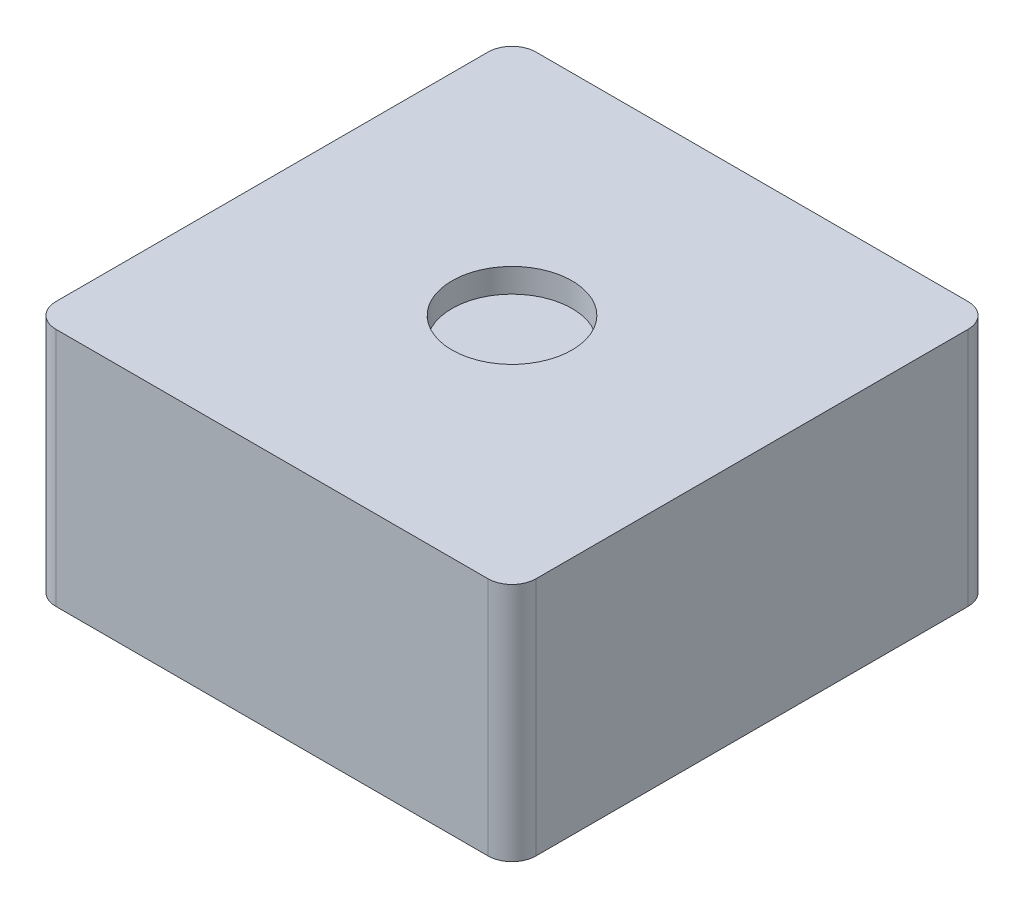
ISO-10303-21;
HEADER;
FILE_DESCRIPTION(('STEP AP214'),'2;1');
FILE_NAME('part.step','',(''),(''),'','','');
FILE_SCHEMA(('AUTOMOTIVE_DESIGN { 1 0 10303 214 1 1 1 1 }'));
ENDSEC;
DATA;
#1=APPLICATION_CONTEXT('core data for automotive mechanical design processes');
#2=APPLICATION_PROTOCOL_DEFINITION('international standard','automotive_design',2000,#1);
#3=PRODUCT_CONTEXT('',#1,'mechanical');
#4=PRODUCT('Part','Part','',(#3));
#5=PRODUCT_RELATED_PRODUCT_CATEGORY('part','',(#4));
#6=PRODUCT_DEFINITION_FORMATION('','',#4);
#7=PRODUCT_DEFINITION_CONTEXT('part definition',#1,'design');
#8=PRODUCT_DEFINITION('design','',#6,#7);
#9=PRODUCT_DEFINITION_SHAPE('','',#8);
#10=(LENGTH_UNIT() NAMED_UNIT(*) SI_UNIT(.MILLI.,.METRE.));
#11=(NAMED_UNIT(*) PLANE_ANGLE_UNIT() SI_UNIT($,.RADIAN.));
#12=(NAMED_UNIT(*) SI_UNIT($,.STERADIAN.) SOLID_ANGLE_UNIT());
#13=UNCERTAINTY_MEASURE_WITH_UNIT(LENGTH_MEASURE(1.E-05),#10,'distance_accuracy_value','');
#14=(GEOMETRIC_REPRESENTATION_CONTEXT(3) GLOBAL_UNCERTAINTY_ASSIGNED_CONTEXT((#13)) GLOBAL_UNIT_ASSIGNED_CONTEXT((#10,
#11,#12)) REPRESENTATION_CONTEXT('',''));
#15=CARTESIAN_POINT('',(0.,0.,0.));
#16=DIRECTION('',(0.,0.,1.));
#17=DIRECTION('',(1.,0.,0.));
#18=AXIS2_PLACEMENT_3D('',#15,#16,#17);
#19=CARTESIAN_POINT('',(0.47619047619,1.8,-0.04761904761905));
#20=DIRECTION('',(0.,1.,0.));
#21=DIRECTION('',(0.,0.,1.));
#22=AXIS2_PLACEMENT_3D('',#19,#20,#21);
#23=PLANE('',#22);
#24=CARTESIAN_POINT('',(0.47619047619,1.8,-0.04761904761905));
#25=DIRECTION('',(0.,1.,0.));
#26=DIRECTION('',(0.,0.,1.));
#27=AXIS2_PLACEMENT_3D('',#24,#25,#26);
#28=CIRCLE('',#27,0.5);
#29=CARTESIAN_POINT('',(0.47619047619,1.8,0.45238095238095));
#30=VERTEX_POINT('',#29);
#31=EDGE_CURVE('E19',#30,#30,#28,.T.);
#32=ORIENTED_EDGE('',*,*,#31,.T.);
#33=EDGE_LOOP('',(#32));
#34=FACE_BOUND('',#33,.T.);
#35=ADVANCED_FACE('F16',(#34),#23,.T.);
#36=CARTESIAN_POINT('',(0.47619047619,1.8,-0.04761904761905));
#37=DIRECTION('',(0.,1.,0.));
#38=DIRECTION('',(0.,0.,1.));
#39=AXIS2_PLACEMENT_3D('',#36,#37,#38);
#40=CYLINDRICAL_SURFACE('',#39,0.5);
#41=CARTESIAN_POINT('',(0.47619047619,2.,-0.04761904761905));
#42=DIRECTION('',(0.,1.,0.));
#43=DIRECTION('',(0.,0.,1.));
#44=AXIS2_PLACEMENT_3D('',#41,#42,#43);
#45=CIRCLE('',#44,0.5);
#46=CARTESIAN_POINT('',(0.47619047619,2.,0.45238095238095));
#47=VERTEX_POINT('',#46);
#48=EDGE_CURVE('E126',#47,#47,#45,.F.);
#49=ORIENTED_EDGE('',*,*,#48,.F.);
#50=EDGE_LOOP('',(#49));
#51=FACE_BOUND('',#50,.T.);
#52=ORIENTED_EDGE('',*,*,#31,.F.);
#53=EDGE_LOOP('',(#52));
#54=FACE_BOUND('',#53,.T.);
#55=ADVANCED_FACE('F193',(#51,#54),#40,.F.);
#56=CARTESIAN_POINT('',(2.27619047619,2.,1.752380952381));
#57=DIRECTION('',(0.,-1.,0.));
#58=DIRECTION('',(0.,0.,-1.));
#59=AXIS2_PLACEMENT_3D('',#56,#57,#58);
#60=CYLINDRICAL_SURFACE('',#59,0.2);
#61=CARTESIAN_POINT('',(2.27619047619,0.,1.752380952381));
#62=DIRECTION('',(0.,-1.,0.));
#63=DIRECTION('',(0.,0.,-1.));
#64=AXIS2_PLACEMENT_3D('',#61,#62,#63);
#65=CIRCLE('',#64,0.2);
#66=CARTESIAN_POINT('',(2.27619047619,0.,1.952380952381));
#67=VERTEX_POINT('',#66);
#68=CARTESIAN_POINT('',(2.47619047619,0.,1.752380952381));
#69=VERTEX_POINT('',#68);
#70=EDGE_CURVE('E57',#67,#69,#65,.F.);
#71=ORIENTED_EDGE('',*,*,#70,.T.);
#72=DIRECTION('',(0.,1.,0.));
#73=VECTOR('',#72,1.);
#74=CARTESIAN_POINT('',(2.47619047619,2.,1.752380952381));
#75=LINE('',#74,#73);
#76=CARTESIAN_POINT('',(2.47619047619,2.,1.752380952381));
#77=VERTEX_POINT('',#76);
#78=EDGE_CURVE('E65',#69,#77,#75,.T.);
#79=ORIENTED_EDGE('',*,*,#78,.T.);
#80=CARTESIAN_POINT('',(2.27619047619,2.,1.752380952381));
#81=DIRECTION('',(0.,-1.,0.));
#82=DIRECTION('',(0.,0.,-1.));
#83=AXIS2_PLACEMENT_3D('',#80,#81,#82);
#84=CIRCLE('',#83,0.2);
#85=CARTESIAN_POINT('',(2.27619047619,2.,1.952380952381));
#86=VERTEX_POINT('',#85);
#87=EDGE_CURVE('E117',#86,#77,#84,.F.);
#88=ORIENTED_EDGE('',*,*,#87,.F.);
#89=DIRECTION('',(0.,1.,0.));
#90=VECTOR('',#89,1.);
#91=CARTESIAN_POINT('',(2.27619047619,2.,1.952380952381));
#92=LINE('',#91,#90);
#93=EDGE_CURVE('E67',#86,#67,#92,.F.);
#94=ORIENTED_EDGE('',*,*,#93,.T.);
#95=EDGE_LOOP('',(#71,#79,#88,#94));
#96=FACE_BOUND('',#95,.T.);
#97=ADVANCED_FACE('F62',(#96),#60,.T.);
#98=CARTESIAN_POINT('',(2.27619047619,2.,-1.847619047619));
#99=DIRECTION('',(0.,-1.,0.));
#100=DIRECTION('',(0.,0.,-1.));
#101=AXIS2_PLACEMENT_3D('',#98,#99,#100);
#102=CYLINDRICAL_SURFACE('',#101,0.2);
#103=CARTESIAN_POINT('',(2.27619047619,0.,-1.847619047619));
#104=DIRECTION('',(0.,-1.,0.));
#105=DIRECTION('',(0.,0.,-1.));
#106=AXIS2_PLACEMENT_3D('',#103,#104,#105);
#107=CIRCLE('',#106,0.2);
#108=CARTESIAN_POINT('',(2.47619047619,0.,-1.847619047619));
#109=VERTEX_POINT('',#108);
#110=CARTESIAN_POINT('',(2.27619047619,0.,-2.047619047619));
#111=VERTEX_POINT('',#110);
#112=EDGE_CURVE('E69',#109,#111,#107,.F.);
#113=ORIENTED_EDGE('',*,*,#112,.T.);
#114=DIRECTION('',(0.,1.,0.));
#115=VECTOR('',#114,1.);
#116=CARTESIAN_POINT('',(2.27619047619,2.,-2.047619047619));
#117=LINE('',#116,#115);
#118=CARTESIAN_POINT('',(2.27619047619,2.,-2.047619047619));
#119=VERTEX_POINT('',#118);
#120=EDGE_CURVE('E96',#111,#119,#117,.T.);
#121=ORIENTED_EDGE('',*,*,#120,.T.);
#122=CARTESIAN_POINT('',(2.27619047619,2.,-1.847619047619));
#123=DIRECTION('',(0.,-1.,0.));
#124=DIRECTION('',(0.,0.,-1.));
#125=AXIS2_PLACEMENT_3D('',#122,#123,#124);
#126=CIRCLE('',#125,0.2);
#127=CARTESIAN_POINT('',(2.47619047619,2.,-1.847619047619));
#128=VERTEX_POINT('',#127);
#129=EDGE_CURVE('E107',#128,#119,#126,.F.);
#130=ORIENTED_EDGE('',*,*,#129,.F.);
#131=DIRECTION('',(0.,1.,0.));
#132=VECTOR('',#131,1.);
#133=CARTESIAN_POINT('',(2.47619047619,2.,-1.847619047619));
#134=LINE('',#133,#132);
#135=EDGE_CURVE('E100',#128,#109,#134,.F.);
#136=ORIENTED_EDGE('',*,*,#135,.T.);
#137=EDGE_LOOP('',(#113,#121,#130,#136));
#138=FACE_BOUND('',#137,.T.);
#139=ADVANCED_FACE('F134',(#138),#102,.T.);
#140=CARTESIAN_POINT('',(-1.32380952381,2.,1.752380952381));
#141=DIRECTION('',(0.,-1.,0.));
#142=DIRECTION('',(0.,0.,-1.));
#143=AXIS2_PLACEMENT_3D('',#140,#141,#142);
#144=CYLINDRICAL_SURFACE('',#143,0.2);
#145=CARTESIAN_POINT('',(-1.32380952381,0.,1.752380952381));
#146=DIRECTION('',(0.,-1.,0.));
#147=DIRECTION('',(0.,0.,-1.));
#148=AXIS2_PLACEMENT_3D('',#145,#146,#147);
#149=CIRCLE('',#148,0.2);
#150=CARTESIAN_POINT('',(-1.52380952381,0.,1.752380952381));
#151=VERTEX_POINT('',#150);
#152=CARTESIAN_POINT('',(-1.32380952381,0.,1.952380952381));
#153=VERTEX_POINT('',#152);
#154=EDGE_CURVE('E130',#151,#153,#149,.F.);
#155=ORIENTED_EDGE('',*,*,#154,.T.);
#156=DIRECTION('',(0.,1.,0.));
#157=VECTOR('',#156,1.);
#158=CARTESIAN_POINT('',(-1.32380952381,2.,1.952380952381));
#159=LINE('',#158,#157);
#160=CARTESIAN_POINT('',(-1.32380952381,2.,1.952380952381));
#161=VERTEX_POINT('',#160);
#162=EDGE_CURVE('E103',#153,#161,#159,.T.);
#163=ORIENTED_EDGE('',*,*,#162,.T.);
#164=CARTESIAN_POINT('',(-1.32380952381,2.,1.752380952381));
#165=DIRECTION('',(0.,-1.,0.));
#166=DIRECTION('',(0.,0.,-1.));
#167=AXIS2_PLACEMENT_3D('',#164,#165,#166);
#168=CIRCLE('',#167,0.2);
#169=CARTESIAN_POINT('',(-1.52380952381,2.,1.752380952381));
#170=VERTEX_POINT('',#169);
#171=EDGE_CURVE('E120',#170,#161,#168,.F.);
#172=ORIENTED_EDGE('',*,*,#171,.F.);
#173=DIRECTION('',(0.,1.,0.));
#174=VECTOR('',#173,1.);
#175=CARTESIAN_POINT('',(-1.52380952381,2.,1.752380952381));
#176=LINE('',#175,#174);
#177=EDGE_CURVE('E92',#170,#151,#176,.F.);
#178=ORIENTED_EDGE('',*,*,#177,.T.);
#179=EDGE_LOOP('',(#155,#163,#172,#178));
#180=FACE_BOUND('',#179,.T.);
#181=ADVANCED_FACE('F167',(#180),#144,.T.);
#182=CARTESIAN_POINT('',(-1.32380952381,2.,-1.847619047619));
#183=DIRECTION('',(0.,-1.,0.));
#184=DIRECTION('',(0.,0.,-1.));
#185=AXIS2_PLACEMENT_3D('',#182,#183,#184);
#186=CYLINDRICAL_SURFACE('',#185,0.2);
#187=CARTESIAN_POINT('',(-1.32380952381,0.,-1.847619047619));
#188=DIRECTION('',(0.,-1.,0.));
#189=DIRECTION('',(0.,0.,-1.));
#190=AXIS2_PLACEMENT_3D('',#187,#188,#189);
#191=CIRCLE('',#190,0.2);
#192=CARTESIAN_POINT('',(-1.32380952381,0.,-2.047619047619));
#193=VERTEX_POINT('',#192);
#194=CARTESIAN_POINT('',(-1.52380952381,0.,-1.847619047619));
#195=VERTEX_POINT('',#194);
#196=EDGE_CURVE('E34',#193,#195,#191,.F.);
#197=ORIENTED_EDGE('',*,*,#196,.T.);
#198=DIRECTION('',(0.,1.,0.));
#199=VECTOR('',#198,1.);
#200=CARTESIAN_POINT('',(-1.52380952381,2.,-1.847619047619));
#201=LINE('',#200,#199);
#202=CARTESIAN_POINT('',(-1.52380952381,2.,-1.847619047619));
#203=VERTEX_POINT('',#202);
#204=EDGE_CURVE('E90',#195,#203,#201,.T.);
#205=ORIENTED_EDGE('',*,*,#204,.T.);
#206=CARTESIAN_POINT('',(-1.32380952381,2.,-1.847619047619));
#207=DIRECTION('',(0.,-1.,0.));
#208=DIRECTION('',(0.,0.,-1.));
#209=AXIS2_PLACEMENT_3D('',#206,#207,#208);
#210=CIRCLE('',#209,0.2);
#211=CARTESIAN_POINT('',(-1.32380952381,2.,-2.047619047619));
#212=VERTEX_POINT('',#211);
#213=EDGE_CURVE('E123',#212,#203,#210,.F.);
#214=ORIENTED_EDGE('',*,*,#213,.F.);
#215=DIRECTION('',(0.,1.,0.));
#216=VECTOR('',#215,1.);
#217=CARTESIAN_POINT('',(-1.32380952381,2.,-2.047619047619));
#218=LINE('',#217,#216);
#219=EDGE_CURVE('E95',#212,#193,#218,.F.);
#220=ORIENTED_EDGE('',*,*,#219,.T.);
#221=EDGE_LOOP('',(#197,#205,#214,#220));
#222=FACE_BOUND('',#221,.T.);
#223=ADVANCED_FACE('F143',(#222),#186,.T.);
#224=CARTESIAN_POINT('',(0.,2.,0.));
#225=DIRECTION('',(0.,1.,0.));
#226=DIRECTION('',(0.,0.,1.));
#227=AXIS2_PLACEMENT_3D('',#224,#225,#226);
#228=PLANE('',#227);
#229=DIRECTION('',(0.,0.,1.));
#230=VECTOR('',#229,1.);
#231=CARTESIAN_POINT('',(2.47619047619,2.,-2.047619047619));
#232=LINE('',#231,#230);
#233=EDGE_CURVE('E77',#77,#128,#232,.F.);
#234=ORIENTED_EDGE('',*,*,#233,.T.);
#235=ORIENTED_EDGE('',*,*,#129,.T.);
#236=DIRECTION('',(1.,0.,0.));
#237=VECTOR('',#236,1.);
#238=CARTESIAN_POINT('',(-1.52380952381,2.,-2.047619047619));
#239=LINE('',#238,#237);
#240=EDGE_CURVE('E99',#119,#212,#239,.F.);
#241=ORIENTED_EDGE('',*,*,#240,.T.);
#242=ORIENTED_EDGE('',*,*,#213,.T.);
#243=DIRECTION('',(0.,0.,-1.));
#244=VECTOR('',#243,1.);
#245=CARTESIAN_POINT('',(-1.52380952381,2.,-2.047619047619));
#246=LINE('',#245,#244);
#247=EDGE_CURVE('E87',#203,#170,#246,.F.);
#248=ORIENTED_EDGE('',*,*,#247,.T.);
#249=ORIENTED_EDGE('',*,*,#171,.T.);
#250=DIRECTION('',(-1.,0.,0.));
#251=VECTOR('',#250,1.);
#252=CARTESIAN_POINT('',(-1.52380952381,2.,1.952380952381));
#253=LINE('',#252,#251);
#254=EDGE_CURVE('E78',#161,#86,#253,.F.);
#255=ORIENTED_EDGE('',*,*,#254,.T.);
#256=ORIENTED_EDGE('',*,*,#87,.T.);
#257=EDGE_LOOP('',(#234,#235,#241,#242,#248,#249,#255,#256));
#258=FACE_BOUND('',#257,.T.);
#259=ORIENTED_EDGE('',*,*,#48,.T.);
#260=EDGE_LOOP('',(#259));
#261=FACE_BOUND('',#260,.T.);
#262=ADVANCED_FACE('F148',(#258,#261),#228,.T.);
#263=CARTESIAN_POINT('',(-1.52380952381,2.,1.952380952381));
#264=DIRECTION('',(0.,0.,-1.));
#265=DIRECTION('',(-1.,0.,0.));
#266=AXIS2_PLACEMENT_3D('',#263,#264,#265);
#267=PLANE('',#266);
#268=ORIENTED_EDGE('',*,*,#162,.F.);
#269=DIRECTION('',(1.,0.,0.));
#270=VECTOR('',#269,1.);
#271=CARTESIAN_POINT('',(0.,0.,1.952380952381));
#272=LINE('',#271,#270);
#273=EDGE_CURVE('E83',#153,#67,#272,.T.);
#274=ORIENTED_EDGE('',*,*,#273,.T.);
#275=ORIENTED_EDGE('',*,*,#93,.F.);
#276=ORIENTED_EDGE('',*,*,#254,.F.);
#277=EDGE_LOOP('',(#268,#274,#275,#276));
#278=FACE_BOUND('',#277,.T.);
#279=ADVANCED_FACE('F166',(#278),#267,.F.);
#280=CARTESIAN_POINT('',(2.47619047619,2.,-2.047619047619));
#281=DIRECTION('',(-1.,0.,0.));
#282=DIRECTION('',(0.,0.,1.));
#283=AXIS2_PLACEMENT_3D('',#280,#281,#282);
#284=PLANE('',#283);
#285=ORIENTED_EDGE('',*,*,#135,.F.);
#286=ORIENTED_EDGE('',*,*,#233,.F.);
#287=ORIENTED_EDGE('',*,*,#78,.F.);
#288=DIRECTION('',(0.,0.,1.));
#289=VECTOR('',#288,1.);
#290=CARTESIAN_POINT('',(2.47619047619,0.,0.));
#291=LINE('',#290,#289);
#292=EDGE_CURVE('E75',#69,#109,#291,.F.);
#293=ORIENTED_EDGE('',*,*,#292,.T.);
#294=EDGE_LOOP('',(#285,#286,#287,#293));
#295=FACE_BOUND('',#294,.T.);
#296=ADVANCED_FACE('F74',(#295),#284,.F.);
#297=CARTESIAN_POINT('',(-1.52380952381,2.,-2.047619047619));
#298=DIRECTION('',(0.,0.,1.));
#299=DIRECTION('',(1.,0.,0.));
#300=AXIS2_PLACEMENT_3D('',#297,#298,#299);
#301=PLANE('',#300);
#302=ORIENTED_EDGE('',*,*,#219,.F.);
#303=ORIENTED_EDGE('',*,*,#240,.F.);
#304=ORIENTED_EDGE('',*,*,#120,.F.);
#305=DIRECTION('',(1.,0.,0.));
#306=VECTOR('',#305,1.);
#307=CARTESIAN_POINT('',(0.,0.,-2.047619047619));
#308=LINE('',#307,#306);
#309=EDGE_CURVE('E25',#111,#193,#308,.F.);
#310=ORIENTED_EDGE('',*,*,#309,.T.);
#311=EDGE_LOOP('',(#302,#303,#304,#310));
#312=FACE_BOUND('',#311,.T.);
#313=ADVANCED_FACE('F140',(#312),#301,.F.);
#314=CARTESIAN_POINT('',(-1.52380952381,2.,-2.047619047619));
#315=DIRECTION('',(1.,0.,0.));
#316=DIRECTION('',(0.,0.,-1.));
#317=AXIS2_PLACEMENT_3D('',#314,#315,#316);
#318=PLANE('',#317);
#319=ORIENTED_EDGE('',*,*,#204,.F.);
#320=DIRECTION('',(0.,0.,1.));
#321=VECTOR('',#320,1.);
#322=CARTESIAN_POINT('',(-1.52380952381,0.,0.));
#323=LINE('',#322,#321);
#324=EDGE_CURVE('E11',#195,#151,#323,.T.);
#325=ORIENTED_EDGE('',*,*,#324,.T.);
#326=ORIENTED_EDGE('',*,*,#177,.F.);
#327=ORIENTED_EDGE('',*,*,#247,.F.);
#328=EDGE_LOOP('',(#319,#325,#326,#327));
#329=FACE_BOUND('',#328,.T.);
#330=ADVANCED_FACE('F169',(#329),#318,.F.);
#331=CARTESIAN_POINT('',(0.,0.,0.));
#332=DIRECTION('',(0.,1.,0.));
#333=DIRECTION('',(0.,0.,1.));
#334=AXIS2_PLACEMENT_3D('',#331,#332,#333);
#335=PLANE('',#334);
#336=ORIENTED_EDGE('',*,*,#196,.F.);
#337=ORIENTED_EDGE('',*,*,#309,.F.);
#338=ORIENTED_EDGE('',*,*,#112,.F.);
#339=ORIENTED_EDGE('',*,*,#292,.F.);
#340=ORIENTED_EDGE('',*,*,#70,.F.);
#341=ORIENTED_EDGE('',*,*,#273,.F.);
#342=ORIENTED_EDGE('',*,*,#154,.F.);
#343=ORIENTED_EDGE('',*,*,#324,.F.);
#344=EDGE_LOOP('',(#336,#337,#338,#339,#340,#341,#342,#343));
#345=FACE_BOUND('',#344,.T.);
#346=ADVANCED_FACE('F80',(#345),#335,.F.);
#347=CLOSED_SHELL('',(#35,#55,#97,#139,#181,#223,#262,#279,#296,#313,#330,#346));
#348=MANIFOLD_SOLID_BREP('B1',#347);
#349=ADVANCED_BREP_SHAPE_REPRESENTATION('',(#18,#348),#14);
#350=SHAPE_DEFINITION_REPRESENTATION(#9,#349);
ENDSEC;
END-ISO-10303-21;
